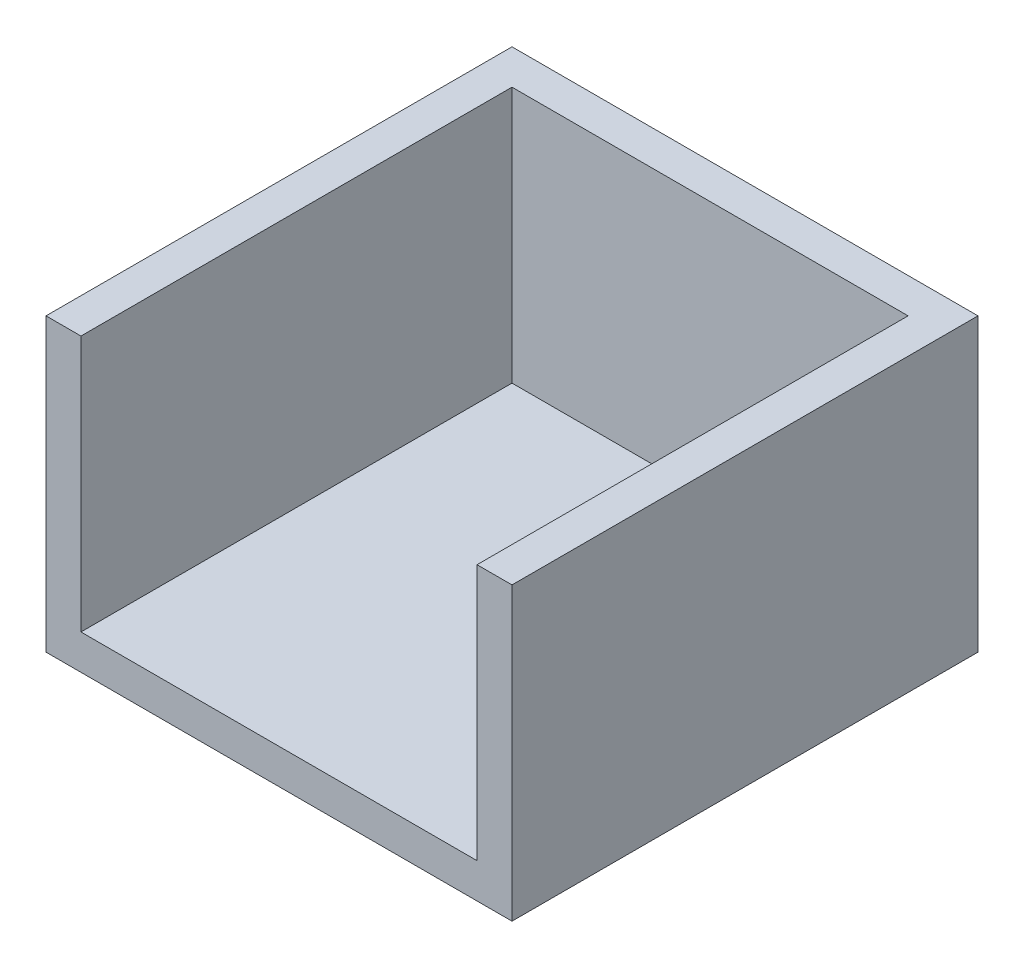
ISO-10303-21;
HEADER;
FILE_DESCRIPTION(('STEP AP214'),'2;1');
FILE_NAME('part.step','',(''),(''),'','','');
FILE_SCHEMA(('AUTOMOTIVE_DESIGN { 1 0 10303 214 1 1 1 1 }'));
ENDSEC;
DATA;
#1=APPLICATION_CONTEXT('core data for automotive mechanical design processes');
#2=APPLICATION_PROTOCOL_DEFINITION('international standard','automotive_design',2000,#1);
#3=PRODUCT_CONTEXT('',#1,'mechanical');
#4=PRODUCT('Part','Part','',(#3));
#5=PRODUCT_RELATED_PRODUCT_CATEGORY('part','',(#4));
#6=PRODUCT_DEFINITION_FORMATION('','',#4);
#7=PRODUCT_DEFINITION_CONTEXT('part definition',#1,'design');
#8=PRODUCT_DEFINITION('design','',#6,#7);
#9=PRODUCT_DEFINITION_SHAPE('','',#8);
#10=(LENGTH_UNIT() NAMED_UNIT(*) SI_UNIT(.MILLI.,.METRE.));
#11=(NAMED_UNIT(*) PLANE_ANGLE_UNIT() SI_UNIT($,.RADIAN.));
#12=(NAMED_UNIT(*) SI_UNIT($,.STERADIAN.) SOLID_ANGLE_UNIT());
#13=UNCERTAINTY_MEASURE_WITH_UNIT(LENGTH_MEASURE(1.E-05),#10,'distance_accuracy_value','');
#14=(GEOMETRIC_REPRESENTATION_CONTEXT(3) GLOBAL_UNCERTAINTY_ASSIGNED_CONTEXT((#13)) GLOBAL_UNIT_ASSIGNED_CONTEXT((#10,
#11,#12)) REPRESENTATION_CONTEXT('',''));
#15=CARTESIAN_POINT('',(0.,0.,0.));
#16=DIRECTION('',(0.,0.,1.));
#17=DIRECTION('',(1.,0.,0.));
#18=AXIS2_PLACEMENT_3D('',#15,#16,#17);
#19=CARTESIAN_POINT('',(-20.,25.,20.));
#20=DIRECTION('',(0.,0.,-1.));
#21=DIRECTION('',(-1.,0.,0.));
#22=AXIS2_PLACEMENT_3D('',#19,#20,#21);
#23=PLANE('',#22);
#24=DIRECTION('',(0.,1.,0.));
#25=VECTOR('',#24,1.);
#26=CARTESIAN_POINT('',(-17.,3.,20.));
#27=LINE('',#26,#25);
#28=CARTESIAN_POINT('',(-17.,3.,20.));
#29=VERTEX_POINT('',#28);
#30=CARTESIAN_POINT('',(-17.,25.,20.));
#31=VERTEX_POINT('',#30);
#32=EDGE_CURVE('E142',#29,#31,#27,.T.);
#33=ORIENTED_EDGE('',*,*,#32,.T.);
#34=DIRECTION('',(1.,0.,0.));
#35=VECTOR('',#34,1.);
#36=CARTESIAN_POINT('',(-20.,25.,20.));
#37=LINE('',#36,#35);
#38=CARTESIAN_POINT('',(-20.,25.,20.));
#39=VERTEX_POINT('',#38);
#40=EDGE_CURVE('E134',#39,#31,#37,.T.);
#41=ORIENTED_EDGE('',*,*,#40,.F.);
#42=DIRECTION('',(0.,-1.,0.));
#43=VECTOR('',#42,1.);
#44=CARTESIAN_POINT('',(-20.,25.,20.));
#45=LINE('',#44,#43);
#46=CARTESIAN_POINT('',(-20.,0.,20.));
#47=VERTEX_POINT('',#46);
#48=EDGE_CURVE('E148',#39,#47,#45,.T.);
#49=ORIENTED_EDGE('',*,*,#48,.T.);
#50=DIRECTION('',(1.,0.,0.));
#51=VECTOR('',#50,1.);
#52=CARTESIAN_POINT('',(-20.,0.,20.));
#53=LINE('',#52,#51);
#54=CARTESIAN_POINT('',(20.,0.,20.));
#55=VERTEX_POINT('',#54);
#56=EDGE_CURVE('E78',#47,#55,#53,.T.);
#57=ORIENTED_EDGE('',*,*,#56,.T.);
#58=DIRECTION('',(0.,-1.,0.));
#59=VECTOR('',#58,1.);
#60=CARTESIAN_POINT('',(20.,25.,20.));
#61=LINE('',#60,#59);
#62=CARTESIAN_POINT('',(20.,25.,20.));
#63=VERTEX_POINT('',#62);
#64=EDGE_CURVE('E137',#63,#55,#61,.T.);
#65=ORIENTED_EDGE('',*,*,#64,.F.);
#66=CARTESIAN_POINT('',(17.,25.,20.));
#67=VERTEX_POINT('',#66);
#68=EDGE_CURVE('E56',#67,#63,#37,.T.);
#69=ORIENTED_EDGE('',*,*,#68,.F.);
#70=DIRECTION('',(0.,1.,0.));
#71=VECTOR('',#70,1.);
#72=CARTESIAN_POINT('',(17.,3.,20.));
#73=LINE('',#72,#71);
#74=CARTESIAN_POINT('',(17.,3.,20.));
#75=VERTEX_POINT('',#74);
#76=EDGE_CURVE('E48',#75,#67,#73,.T.);
#77=ORIENTED_EDGE('',*,*,#76,.F.);
#78=DIRECTION('',(1.,0.,0.));
#79=VECTOR('',#78,1.);
#80=CARTESIAN_POINT('',(0.,3.,20.));
#81=LINE('',#80,#79);
#82=EDGE_CURVE('E114',#29,#75,#81,.T.);
#83=ORIENTED_EDGE('',*,*,#82,.F.);
#84=EDGE_LOOP('',(#33,#41,#49,#57,#65,#69,#77,#83));
#85=FACE_BOUND('',#84,.T.);
#86=ADVANCED_FACE('F33',(#85),#23,.F.);
#87=CARTESIAN_POINT('',(0.,25.,0.));
#88=DIRECTION('',(0.,1.,0.));
#89=DIRECTION('',(0.,0.,1.));
#90=AXIS2_PLACEMENT_3D('',#87,#88,#89);
#91=PLANE('',#90);
#92=ORIENTED_EDGE('',*,*,#40,.T.);
#93=DIRECTION('',(0.,0.,-1.));
#94=VECTOR('',#93,1.);
#95=CARTESIAN_POINT('',(-17.,25.,0.));
#96=LINE('',#95,#94);
#97=CARTESIAN_POINT('',(-17.,25.,-17.));
#98=VERTEX_POINT('',#97);
#99=EDGE_CURVE('E121',#31,#98,#96,.T.);
#100=ORIENTED_EDGE('',*,*,#99,.T.);
#101=DIRECTION('',(-1.,0.,0.));
#102=VECTOR('',#101,1.);
#103=CARTESIAN_POINT('',(0.,25.,-17.));
#104=LINE('',#103,#102);
#105=CARTESIAN_POINT('',(17.,25.,-17.));
#106=VERTEX_POINT('',#105);
#107=EDGE_CURVE('E168',#106,#98,#104,.T.);
#108=ORIENTED_EDGE('',*,*,#107,.F.);
#109=DIRECTION('',(0.,0.,-1.));
#110=VECTOR('',#109,1.);
#111=CARTESIAN_POINT('',(17.,25.,0.));
#112=LINE('',#111,#110);
#113=EDGE_CURVE('E171',#67,#106,#112,.T.);
#114=ORIENTED_EDGE('',*,*,#113,.F.);
#115=ORIENTED_EDGE('',*,*,#68,.T.);
#116=DIRECTION('',(0.,0.,-1.));
#117=VECTOR('',#116,1.);
#118=CARTESIAN_POINT('',(20.,25.,-20.));
#119=LINE('',#118,#117);
#120=CARTESIAN_POINT('',(20.,25.,-20.));
#121=VERTEX_POINT('',#120);
#122=EDGE_CURVE('E129',#63,#121,#119,.T.);
#123=ORIENTED_EDGE('',*,*,#122,.T.);
#124=DIRECTION('',(-1.,0.,0.));
#125=VECTOR('',#124,1.);
#126=CARTESIAN_POINT('',(-20.,25.,-20.));
#127=LINE('',#126,#125);
#128=CARTESIAN_POINT('',(-20.,25.,-20.));
#129=VERTEX_POINT('',#128);
#130=EDGE_CURVE('E85',#121,#129,#127,.T.);
#131=ORIENTED_EDGE('',*,*,#130,.T.);
#132=DIRECTION('',(0.,0.,1.));
#133=VECTOR('',#132,1.);
#134=CARTESIAN_POINT('',(-20.,25.,-20.));
#135=LINE('',#134,#133);
#136=EDGE_CURVE('E132',#129,#39,#135,.T.);
#137=ORIENTED_EDGE('',*,*,#136,.T.);
#138=EDGE_LOOP('',(#92,#100,#108,#114,#115,#123,#131,#137));
#139=FACE_BOUND('',#138,.T.);
#140=ADVANCED_FACE('F161',(#139),#91,.T.);
#141=CARTESIAN_POINT('',(20.,25.,-20.));
#142=DIRECTION('',(-1.,0.,0.));
#143=DIRECTION('',(0.,0.,1.));
#144=AXIS2_PLACEMENT_3D('',#141,#142,#143);
#145=PLANE('',#144);
#146=DIRECTION('',(0.,0.,-1.));
#147=VECTOR('',#146,1.);
#148=CARTESIAN_POINT('',(20.,0.,-20.));
#149=LINE('',#148,#147);
#150=CARTESIAN_POINT('',(20.,0.,-20.));
#151=VERTEX_POINT('',#150);
#152=EDGE_CURVE('E138',#55,#151,#149,.T.);
#153=ORIENTED_EDGE('',*,*,#152,.T.);
#154=DIRECTION('',(0.,-1.,0.));
#155=VECTOR('',#154,1.);
#156=CARTESIAN_POINT('',(20.,25.,-20.));
#157=LINE('',#156,#155);
#158=EDGE_CURVE('E11',#121,#151,#157,.T.);
#159=ORIENTED_EDGE('',*,*,#158,.F.);
#160=ORIENTED_EDGE('',*,*,#122,.F.);
#161=ORIENTED_EDGE('',*,*,#64,.T.);
#162=EDGE_LOOP('',(#153,#159,#160,#161));
#163=FACE_BOUND('',#162,.T.);
#164=ADVANCED_FACE('F35',(#163),#145,.F.);
#165=CARTESIAN_POINT('',(-20.,25.,-20.));
#166=DIRECTION('',(0.,0.,1.));
#167=DIRECTION('',(1.,0.,0.));
#168=AXIS2_PLACEMENT_3D('',#165,#166,#167);
#169=PLANE('',#168);
#170=DIRECTION('',(-1.,0.,0.));
#171=VECTOR('',#170,1.);
#172=CARTESIAN_POINT('',(-20.,0.,-20.));
#173=LINE('',#172,#171);
#174=CARTESIAN_POINT('',(-20.,0.,-20.));
#175=VERTEX_POINT('',#174);
#176=EDGE_CURVE('E141',#151,#175,#173,.T.);
#177=ORIENTED_EDGE('',*,*,#176,.T.);
#178=DIRECTION('',(0.,-1.,0.));
#179=VECTOR('',#178,1.);
#180=CARTESIAN_POINT('',(-20.,25.,-20.));
#181=LINE('',#180,#179);
#182=EDGE_CURVE('E41',#129,#175,#181,.T.);
#183=ORIENTED_EDGE('',*,*,#182,.F.);
#184=ORIENTED_EDGE('',*,*,#130,.F.);
#185=ORIENTED_EDGE('',*,*,#158,.T.);
#186=EDGE_LOOP('',(#177,#183,#184,#185));
#187=FACE_BOUND('',#186,.T.);
#188=ADVANCED_FACE('F195',(#187),#169,.F.);
#189=CARTESIAN_POINT('',(-20.,25.,-20.));
#190=DIRECTION('',(1.,0.,0.));
#191=DIRECTION('',(0.,0.,-1.));
#192=AXIS2_PLACEMENT_3D('',#189,#190,#191);
#193=PLANE('',#192);
#194=DIRECTION('',(0.,0.,1.));
#195=VECTOR('',#194,1.);
#196=CARTESIAN_POINT('',(-20.,0.,-20.));
#197=LINE('',#196,#195);
#198=EDGE_CURVE('E144',#175,#47,#197,.T.);
#199=ORIENTED_EDGE('',*,*,#198,.T.);
#200=ORIENTED_EDGE('',*,*,#48,.F.);
#201=ORIENTED_EDGE('',*,*,#136,.F.);
#202=ORIENTED_EDGE('',*,*,#182,.T.);
#203=EDGE_LOOP('',(#199,#200,#201,#202));
#204=FACE_BOUND('',#203,.T.);
#205=ADVANCED_FACE('F153',(#204),#193,.F.);
#206=CARTESIAN_POINT('',(0.,0.,0.));
#207=DIRECTION('',(0.,1.,0.));
#208=DIRECTION('',(0.,0.,1.));
#209=AXIS2_PLACEMENT_3D('',#206,#207,#208);
#210=PLANE('',#209);
#211=ORIENTED_EDGE('',*,*,#152,.F.);
#212=ORIENTED_EDGE('',*,*,#56,.F.);
#213=ORIENTED_EDGE('',*,*,#198,.F.);
#214=ORIENTED_EDGE('',*,*,#176,.F.);
#215=EDGE_LOOP('',(#211,#212,#213,#214));
#216=FACE_BOUND('',#215,.T.);
#217=ADVANCED_FACE('F157',(#216),#210,.F.);
#218=CARTESIAN_POINT('',(-17.,3.,0.));
#219=DIRECTION('',(1.,0.,0.));
#220=DIRECTION('',(0.,0.,-1.));
#221=AXIS2_PLACEMENT_3D('',#218,#219,#220);
#222=PLANE('',#221);
#223=ORIENTED_EDGE('',*,*,#99,.F.);
#224=ORIENTED_EDGE('',*,*,#32,.F.);
#225=DIRECTION('',(0.,0.,-1.));
#226=VECTOR('',#225,1.);
#227=CARTESIAN_POINT('',(-17.,3.,0.));
#228=LINE('',#227,#226);
#229=CARTESIAN_POINT('',(-17.,3.,-17.));
#230=VERTEX_POINT('',#229);
#231=EDGE_CURVE('E119',#29,#230,#228,.T.);
#232=ORIENTED_EDGE('',*,*,#231,.T.);
#233=DIRECTION('',(0.,1.,0.));
#234=VECTOR('',#233,1.);
#235=CARTESIAN_POINT('',(-17.,3.,-17.));
#236=LINE('',#235,#234);
#237=EDGE_CURVE('E124',#230,#98,#236,.T.);
#238=ORIENTED_EDGE('',*,*,#237,.T.);
#239=EDGE_LOOP('',(#223,#224,#232,#238));
#240=FACE_BOUND('',#239,.T.);
#241=ADVANCED_FACE('F177',(#240),#222,.T.);
#242=CARTESIAN_POINT('',(0.,3.,-17.));
#243=DIRECTION('',(0.,0.,-1.));
#244=DIRECTION('',(-1.,0.,0.));
#245=AXIS2_PLACEMENT_3D('',#242,#243,#244);
#246=PLANE('',#245);
#247=ORIENTED_EDGE('',*,*,#107,.T.);
#248=ORIENTED_EDGE('',*,*,#237,.F.);
#249=DIRECTION('',(-1.,0.,0.));
#250=VECTOR('',#249,1.);
#251=CARTESIAN_POINT('',(0.,3.,-17.));
#252=LINE('',#251,#250);
#253=CARTESIAN_POINT('',(17.,3.,-17.));
#254=VERTEX_POINT('',#253);
#255=EDGE_CURVE('E113',#254,#230,#252,.T.);
#256=ORIENTED_EDGE('',*,*,#255,.F.);
#257=DIRECTION('',(0.,1.,0.));
#258=VECTOR('',#257,1.);
#259=CARTESIAN_POINT('',(17.,3.,-17.));
#260=LINE('',#259,#258);
#261=EDGE_CURVE('E109',#254,#106,#260,.T.);
#262=ORIENTED_EDGE('',*,*,#261,.T.);
#263=EDGE_LOOP('',(#247,#248,#256,#262));
#264=FACE_BOUND('',#263,.T.);
#265=ADVANCED_FACE('F175',(#264),#246,.F.);
#266=CARTESIAN_POINT('',(17.,3.,0.));
#267=DIRECTION('',(1.,0.,0.));
#268=DIRECTION('',(0.,0.,-1.));
#269=AXIS2_PLACEMENT_3D('',#266,#267,#268);
#270=PLANE('',#269);
#271=ORIENTED_EDGE('',*,*,#113,.T.);
#272=ORIENTED_EDGE('',*,*,#261,.F.);
#273=DIRECTION('',(0.,0.,-1.));
#274=VECTOR('',#273,1.);
#275=CARTESIAN_POINT('',(17.,3.,0.));
#276=LINE('',#275,#274);
#277=EDGE_CURVE('E106',#75,#254,#276,.T.);
#278=ORIENTED_EDGE('',*,*,#277,.F.);
#279=ORIENTED_EDGE('',*,*,#76,.T.);
#280=EDGE_LOOP('',(#271,#272,#278,#279));
#281=FACE_BOUND('',#280,.T.);
#282=ADVANCED_FACE('F108',(#281),#270,.F.);
#283=CARTESIAN_POINT('',(0.,3.,0.));
#284=DIRECTION('',(0.,1.,0.));
#285=DIRECTION('',(0.,0.,1.));
#286=AXIS2_PLACEMENT_3D('',#283,#284,#285);
#287=PLANE('',#286);
#288=ORIENTED_EDGE('',*,*,#82,.T.);
#289=ORIENTED_EDGE('',*,*,#277,.T.);
#290=ORIENTED_EDGE('',*,*,#255,.T.);
#291=ORIENTED_EDGE('',*,*,#231,.F.);
#292=EDGE_LOOP('',(#288,#289,#290,#291));
#293=FACE_BOUND('',#292,.T.);
#294=ADVANCED_FACE('F118',(#293),#287,.T.);
#295=CLOSED_SHELL('',(#86,#140,#164,#188,#205,#217,#241,#265,#282,#294));
#296=MANIFOLD_SOLID_BREP('B2',#295);
#297=ADVANCED_BREP_SHAPE_REPRESENTATION('',(#18,#296),#14);
#298=SHAPE_DEFINITION_REPRESENTATION(#9,#297);
ENDSEC;
END-ISO-10303-21;
